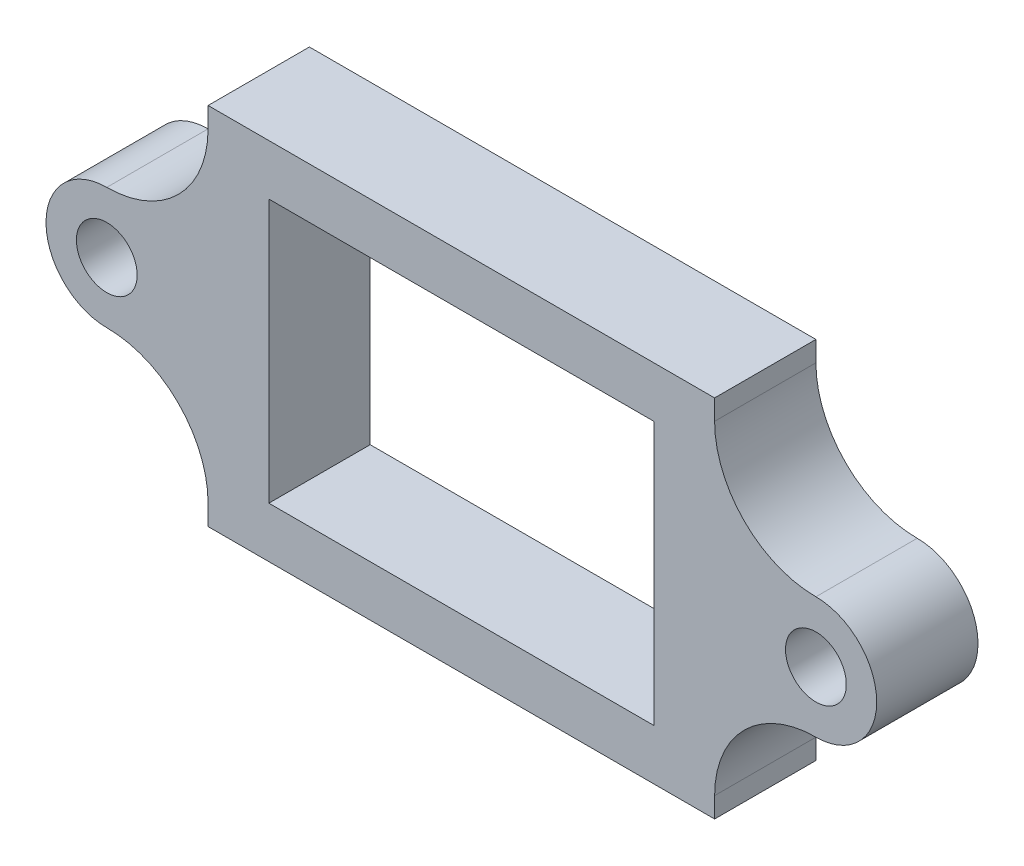
ISO-10303-21;
HEADER;
FILE_DESCRIPTION(('STEP AP214'),'2;1');
FILE_NAME('part.step','',(''),(''),'','','');
FILE_SCHEMA(('AUTOMOTIVE_DESIGN { 1 0 10303 214 1 1 1 1 }'));
ENDSEC;
DATA;
#1=APPLICATION_CONTEXT('core data for automotive mechanical design processes');
#2=APPLICATION_PROTOCOL_DEFINITION('international standard','automotive_design',2000,#1);
#3=PRODUCT_CONTEXT('',#1,'mechanical');
#4=PRODUCT('Part','Part','',(#3));
#5=PRODUCT_RELATED_PRODUCT_CATEGORY('part','',(#4));
#6=PRODUCT_DEFINITION_FORMATION('','',#4);
#7=PRODUCT_DEFINITION_CONTEXT('part definition',#1,'design');
#8=PRODUCT_DEFINITION('design','',#6,#7);
#9=PRODUCT_DEFINITION_SHAPE('','',#8);
#10=(LENGTH_UNIT() NAMED_UNIT(*) SI_UNIT(.MILLI.,.METRE.));
#11=(NAMED_UNIT(*) PLANE_ANGLE_UNIT() SI_UNIT($,.RADIAN.));
#12=(NAMED_UNIT(*) SI_UNIT($,.STERADIAN.) SOLID_ANGLE_UNIT());
#13=UNCERTAINTY_MEASURE_WITH_UNIT(LENGTH_MEASURE(1.E-05),#10,'distance_accuracy_value','');
#14=(GEOMETRIC_REPRESENTATION_CONTEXT(3) GLOBAL_UNCERTAINTY_ASSIGNED_CONTEXT((#13)) GLOBAL_UNIT_ASSIGNED_CONTEXT((#10,
#11,#12)) REPRESENTATION_CONTEXT('',''));
#15=CARTESIAN_POINT('',(0.,0.,0.));
#16=DIRECTION('',(0.,0.,1.));
#17=DIRECTION('',(1.,0.,0.));
#18=AXIS2_PLACEMENT_3D('',#15,#16,#17);
#19=CARTESIAN_POINT('',(-12.5,-9.,5.));
#20=DIRECTION('',(1.,0.,0.));
#21=DIRECTION('',(0.,0.,-1.));
#22=AXIS2_PLACEMENT_3D('',#19,#20,#21);
#23=PLANE('',#22);
#24=DIRECTION('',(0.,-1.,0.));
#25=VECTOR('',#24,1.);
#26=CARTESIAN_POINT('',(-12.5,-9.,0.));
#27=LINE('',#26,#25);
#28=CARTESIAN_POINT('',(-12.5,9.,0.));
#29=VERTEX_POINT('',#28);
#30=CARTESIAN_POINT('',(-12.5,8.,0.));
#31=VERTEX_POINT('',#30);
#32=EDGE_CURVE('E249',#29,#31,#27,.T.);
#33=ORIENTED_EDGE('',*,*,#32,.T.);
#34=DIRECTION('',(0.,0.,-1.));
#35=VECTOR('',#34,1.);
#36=CARTESIAN_POINT('',(-12.5,8.,5.));
#37=LINE('',#36,#35);
#38=CARTESIAN_POINT('',(-12.5,8.,5.));
#39=VERTEX_POINT('',#38);
#40=EDGE_CURVE('E267',#31,#39,#37,.F.);
#41=ORIENTED_EDGE('',*,*,#40,.T.);
#42=DIRECTION('',(0.,-1.,0.));
#43=VECTOR('',#42,1.);
#44=CARTESIAN_POINT('',(-12.5,-9.,5.));
#45=LINE('',#44,#43);
#46=CARTESIAN_POINT('',(-12.5,9.,5.));
#47=VERTEX_POINT('',#46);
#48=EDGE_CURVE('E239',#47,#39,#45,.T.);
#49=ORIENTED_EDGE('',*,*,#48,.F.);
#50=DIRECTION('',(0.,0.,-1.));
#51=VECTOR('',#50,1.);
#52=CARTESIAN_POINT('',(-12.5,9.,5.));
#53=LINE('',#52,#51);
#54=EDGE_CURVE('E259',#47,#29,#53,.T.);
#55=ORIENTED_EDGE('',*,*,#54,.T.);
#56=EDGE_LOOP('',(#33,#41,#49,#55));
#57=FACE_BOUND('',#56,.T.);
#58=ADVANCED_FACE('F37',(#57),#23,.F.);
#59=CARTESIAN_POINT('',(12.5,-9.,5.));
#60=DIRECTION('',(-1.,0.,0.));
#61=DIRECTION('',(0.,0.,1.));
#62=AXIS2_PLACEMENT_3D('',#59,#60,#61);
#63=PLANE('',#62);
#64=DIRECTION('',(0.,1.,0.));
#65=VECTOR('',#64,1.);
#66=CARTESIAN_POINT('',(12.5,-9.,0.));
#67=LINE('',#66,#65);
#68=CARTESIAN_POINT('',(12.5,-9.,0.));
#69=VERTEX_POINT('',#68);
#70=CARTESIAN_POINT('',(12.5,-8.,0.));
#71=VERTEX_POINT('',#70);
#72=EDGE_CURVE('E245',#69,#71,#67,.T.);
#73=ORIENTED_EDGE('',*,*,#72,.T.);
#74=DIRECTION('',(0.,0.,-1.));
#75=VECTOR('',#74,1.);
#76=CARTESIAN_POINT('',(12.5,-8.,5.));
#77=LINE('',#76,#75);
#78=CARTESIAN_POINT('',(12.5,-8.,5.));
#79=VERTEX_POINT('',#78);
#80=EDGE_CURVE('E58',#71,#79,#77,.F.);
#81=ORIENTED_EDGE('',*,*,#80,.T.);
#82=DIRECTION('',(0.,1.,0.));
#83=VECTOR('',#82,1.);
#84=CARTESIAN_POINT('',(12.5,-9.,5.));
#85=LINE('',#84,#83);
#86=CARTESIAN_POINT('',(12.5,-9.,5.));
#87=VERTEX_POINT('',#86);
#88=EDGE_CURVE('E233',#87,#79,#85,.T.);
#89=ORIENTED_EDGE('',*,*,#88,.F.);
#90=DIRECTION('',(0.,0.,-1.));
#91=VECTOR('',#90,1.);
#92=CARTESIAN_POINT('',(12.5,-9.,5.));
#93=LINE('',#92,#91);
#94=EDGE_CURVE('E244',#87,#69,#93,.T.);
#95=ORIENTED_EDGE('',*,*,#94,.T.);
#96=EDGE_LOOP('',(#73,#81,#89,#95));
#97=FACE_BOUND('',#96,.T.);
#98=ADVANCED_FACE('F304',(#97),#63,.F.);
#99=CARTESIAN_POINT('',(0.,0.,5.));
#100=DIRECTION('',(0.,0.,-1.));
#101=DIRECTION('',(-1.,0.,0.));
#102=AXIS2_PLACEMENT_3D('',#99,#100,#101);
#103=PLANE('',#102);
#104=ORIENTED_EDGE('',*,*,#88,.T.);
#105=CARTESIAN_POINT('',(17.5,-8.,5.));
#106=DIRECTION('',(0.,0.,-1.));
#107=DIRECTION('',(-1.,0.,0.));
#108=AXIS2_PLACEMENT_3D('',#105,#106,#107);
#109=CIRCLE('',#108,5.);
#110=CARTESIAN_POINT('',(17.5,-3.,5.));
#111=VERTEX_POINT('',#110);
#112=EDGE_CURVE('E11',#79,#111,#109,.T.);
#113=ORIENTED_EDGE('',*,*,#112,.T.);
#114=CARTESIAN_POINT('',(17.5,0.,5.));
#115=DIRECTION('',(0.,0.,-1.));
#116=DIRECTION('',(-1.,0.,0.));
#117=AXIS2_PLACEMENT_3D('',#114,#115,#116);
#118=CIRCLE('',#117,3.);
#119=CARTESIAN_POINT('',(17.5,3.,5.));
#120=VERTEX_POINT('',#119);
#121=EDGE_CURVE('E191',#120,#111,#118,.T.);
#122=ORIENTED_EDGE('',*,*,#121,.F.);
#123=CARTESIAN_POINT('',(17.5,8.,5.));
#124=DIRECTION('',(0.,0.,-1.));
#125=DIRECTION('',(-1.,0.,0.));
#126=AXIS2_PLACEMENT_3D('',#123,#124,#125);
#127=CIRCLE('',#126,5.);
#128=CARTESIAN_POINT('',(12.5,8.,5.));
#129=VERTEX_POINT('',#128);
#130=EDGE_CURVE('E280',#120,#129,#127,.T.);
#131=ORIENTED_EDGE('',*,*,#130,.T.);
#132=CARTESIAN_POINT('',(12.5,9.,5.));
#133=VERTEX_POINT('',#132);
#134=EDGE_CURVE('E236',#129,#133,#85,.T.);
#135=ORIENTED_EDGE('',*,*,#134,.T.);
#136=DIRECTION('',(-1.,0.,0.));
#137=VECTOR('',#136,1.);
#138=CARTESIAN_POINT('',(-12.5,9.,5.));
#139=LINE('',#138,#137);
#140=EDGE_CURVE('E235',#133,#47,#139,.T.);
#141=ORIENTED_EDGE('',*,*,#140,.T.);
#142=ORIENTED_EDGE('',*,*,#48,.T.);
#143=CARTESIAN_POINT('',(-17.5,8.,5.));
#144=DIRECTION('',(0.,0.,-1.));
#145=DIRECTION('',(-1.,0.,0.));
#146=AXIS2_PLACEMENT_3D('',#143,#144,#145);
#147=CIRCLE('',#146,5.);
#148=CARTESIAN_POINT('',(-17.5,3.,5.));
#149=VERTEX_POINT('',#148);
#150=EDGE_CURVE('E276',#39,#149,#147,.T.);
#151=ORIENTED_EDGE('',*,*,#150,.T.);
#152=CARTESIAN_POINT('',(-17.5,0.,5.));
#153=DIRECTION('',(0.,0.,-1.));
#154=DIRECTION('',(1.,0.,0.));
#155=AXIS2_PLACEMENT_3D('',#152,#153,#154);
#156=CIRCLE('',#155,3.);
#157=CARTESIAN_POINT('',(-17.5,-3.,5.));
#158=VERTEX_POINT('',#157);
#159=EDGE_CURVE('E171',#158,#149,#156,.T.);
#160=ORIENTED_EDGE('',*,*,#159,.F.);
#161=CARTESIAN_POINT('',(-17.5,-8.,5.));
#162=DIRECTION('',(0.,0.,-1.));
#163=DIRECTION('',(-1.,0.,0.));
#164=AXIS2_PLACEMENT_3D('',#161,#162,#163);
#165=CIRCLE('',#164,5.);
#166=CARTESIAN_POINT('',(-12.5,-8.,5.));
#167=VERTEX_POINT('',#166);
#168=EDGE_CURVE('E160',#158,#167,#165,.T.);
#169=ORIENTED_EDGE('',*,*,#168,.T.);
#170=CARTESIAN_POINT('',(-12.5,-9.,5.));
#171=VERTEX_POINT('',#170);
#172=EDGE_CURVE('E238',#167,#171,#45,.T.);
#173=ORIENTED_EDGE('',*,*,#172,.T.);
#174=DIRECTION('',(1.,0.,0.));
#175=VECTOR('',#174,1.);
#176=CARTESIAN_POINT('',(-12.5,-9.,5.));
#177=LINE('',#176,#175);
#178=EDGE_CURVE('E242',#171,#87,#177,.T.);
#179=ORIENTED_EDGE('',*,*,#178,.T.);
#180=EDGE_LOOP('',(#104,#113,#122,#131,#135,#141,#142,#151,#160,#169,#173,#179));
#181=FACE_BOUND('',#180,.T.);
#182=DIRECTION('',(0.,1.,0.));
#183=VECTOR('',#182,1.);
#184=CARTESIAN_POINT('',(9.5,-6.5,5.));
#185=LINE('',#184,#183);
#186=CARTESIAN_POINT('',(9.5,-6.5,5.));
#187=VERTEX_POINT('',#186);
#188=CARTESIAN_POINT('',(9.5,6.5,5.));
#189=VERTEX_POINT('',#188);
#190=EDGE_CURVE('E202',#187,#189,#185,.T.);
#191=ORIENTED_EDGE('',*,*,#190,.F.);
#192=DIRECTION('',(1.,0.,0.));
#193=VECTOR('',#192,1.);
#194=CARTESIAN_POINT('',(-9.5,-6.5,5.));
#195=LINE('',#194,#193);
#196=CARTESIAN_POINT('',(-9.5,-6.5,5.));
#197=VERTEX_POINT('',#196);
#198=EDGE_CURVE('E210',#197,#187,#195,.T.);
#199=ORIENTED_EDGE('',*,*,#198,.F.);
#200=DIRECTION('',(0.,-1.,0.));
#201=VECTOR('',#200,1.);
#202=CARTESIAN_POINT('',(-9.5,-6.5,5.));
#203=LINE('',#202,#201);
#204=CARTESIAN_POINT('',(-9.5,6.5,5.));
#205=VERTEX_POINT('',#204);
#206=EDGE_CURVE('E207',#205,#197,#203,.T.);
#207=ORIENTED_EDGE('',*,*,#206,.F.);
#208=DIRECTION('',(-1.,0.,0.));
#209=VECTOR('',#208,1.);
#210=CARTESIAN_POINT('',(-9.5,6.5,5.));
#211=LINE('',#210,#209);
#212=EDGE_CURVE('E204',#189,#205,#211,.T.);
#213=ORIENTED_EDGE('',*,*,#212,.F.);
#214=EDGE_LOOP('',(#191,#199,#207,#213));
#215=FACE_BOUND('',#214,.T.);
#216=CARTESIAN_POINT('',(17.5,0.,5.));
#217=DIRECTION('',(0.,0.,-1.));
#218=DIRECTION('',(-1.,0.,0.));
#219=AXIS2_PLACEMENT_3D('',#216,#217,#218);
#220=CIRCLE('',#219,1.5);
#221=CARTESIAN_POINT('',(16.,0.,5.));
#222=VERTEX_POINT('',#221);
#223=EDGE_CURVE('E185',#222,#222,#220,.T.);
#224=ORIENTED_EDGE('',*,*,#223,.T.);
#225=EDGE_LOOP('',(#224));
#226=FACE_BOUND('',#225,.T.);
#227=CARTESIAN_POINT('',(-17.5,0.,5.));
#228=DIRECTION('',(0.,0.,-1.));
#229=DIRECTION('',(1.,0.,0.));
#230=AXIS2_PLACEMENT_3D('',#227,#228,#229);
#231=CIRCLE('',#230,1.5);
#232=CARTESIAN_POINT('',(-16.,0.,5.));
#233=VERTEX_POINT('',#232);
#234=EDGE_CURVE('E170',#233,#233,#231,.T.);
#235=ORIENTED_EDGE('',*,*,#234,.T.);
#236=EDGE_LOOP('',(#235));
#237=FACE_BOUND('',#236,.T.);
#238=ADVANCED_FACE('F285',(#181,#215,#226,#237),#103,.F.);
#239=CARTESIAN_POINT('',(0.,0.,0.));
#240=DIRECTION('',(0.,0.,-1.));
#241=DIRECTION('',(-1.,0.,0.));
#242=AXIS2_PLACEMENT_3D('',#239,#240,#241);
#243=PLANE('',#242);
#244=ORIENTED_EDGE('',*,*,#72,.F.);
#245=DIRECTION('',(1.,0.,0.));
#246=VECTOR('',#245,1.);
#247=CARTESIAN_POINT('',(-12.5,-9.,0.));
#248=LINE('',#247,#246);
#249=CARTESIAN_POINT('',(-12.5,-9.,0.));
#250=VERTEX_POINT('',#249);
#251=EDGE_CURVE('E252',#250,#69,#248,.T.);
#252=ORIENTED_EDGE('',*,*,#251,.F.);
#253=CARTESIAN_POINT('',(-12.5,-8.,0.));
#254=VERTEX_POINT('',#253);
#255=EDGE_CURVE('E155',#254,#250,#27,.T.);
#256=ORIENTED_EDGE('',*,*,#255,.F.);
#257=CARTESIAN_POINT('',(-17.5,-8.,0.));
#258=DIRECTION('',(0.,0.,-1.));
#259=DIRECTION('',(-1.,0.,0.));
#260=AXIS2_PLACEMENT_3D('',#257,#258,#259);
#261=CIRCLE('',#260,5.);
#262=CARTESIAN_POINT('',(-17.5,-3.,0.));
#263=VERTEX_POINT('',#262);
#264=EDGE_CURVE('E149',#254,#263,#261,.F.);
#265=ORIENTED_EDGE('',*,*,#264,.T.);
#266=CARTESIAN_POINT('',(-17.5,0.,0.));
#267=DIRECTION('',(0.,0.,-1.));
#268=DIRECTION('',(1.,0.,0.));
#269=AXIS2_PLACEMENT_3D('',#266,#267,#268);
#270=CIRCLE('',#269,3.);
#271=CARTESIAN_POINT('',(-17.5,3.,0.));
#272=VERTEX_POINT('',#271);
#273=EDGE_CURVE('E153',#263,#272,#270,.T.);
#274=ORIENTED_EDGE('',*,*,#273,.T.);
#275=CARTESIAN_POINT('',(-17.5,8.,0.));
#276=DIRECTION('',(0.,0.,-1.));
#277=DIRECTION('',(-1.,0.,0.));
#278=AXIS2_PLACEMENT_3D('',#275,#276,#277);
#279=CIRCLE('',#278,5.);
#280=EDGE_CURVE('E274',#272,#31,#279,.F.);
#281=ORIENTED_EDGE('',*,*,#280,.T.);
#282=ORIENTED_EDGE('',*,*,#32,.F.);
#283=DIRECTION('',(-1.,0.,0.));
#284=VECTOR('',#283,1.);
#285=CARTESIAN_POINT('',(-12.5,9.,0.));
#286=LINE('',#285,#284);
#287=CARTESIAN_POINT('',(12.5,9.,0.));
#288=VERTEX_POINT('',#287);
#289=EDGE_CURVE('E247',#288,#29,#286,.T.);
#290=ORIENTED_EDGE('',*,*,#289,.F.);
#291=CARTESIAN_POINT('',(12.5,8.,0.));
#292=VERTEX_POINT('',#291);
#293=EDGE_CURVE('E232',#292,#288,#67,.T.);
#294=ORIENTED_EDGE('',*,*,#293,.F.);
#295=CARTESIAN_POINT('',(17.5,8.,0.));
#296=DIRECTION('',(0.,0.,-1.));
#297=DIRECTION('',(-1.,0.,0.));
#298=AXIS2_PLACEMENT_3D('',#295,#296,#297);
#299=CIRCLE('',#298,5.);
#300=CARTESIAN_POINT('',(17.5,3.,0.));
#301=VERTEX_POINT('',#300);
#302=EDGE_CURVE('E278',#292,#301,#299,.F.);
#303=ORIENTED_EDGE('',*,*,#302,.T.);
#304=CARTESIAN_POINT('',(17.5,0.,0.));
#305=DIRECTION('',(0.,0.,-1.));
#306=DIRECTION('',(-1.,0.,0.));
#307=AXIS2_PLACEMENT_3D('',#304,#305,#306);
#308=CIRCLE('',#307,3.);
#309=CARTESIAN_POINT('',(17.5,-3.,0.));
#310=VERTEX_POINT('',#309);
#311=EDGE_CURVE('E188',#301,#310,#308,.T.);
#312=ORIENTED_EDGE('',*,*,#311,.T.);
#313=CARTESIAN_POINT('',(17.5,-8.,0.));
#314=DIRECTION('',(0.,0.,-1.));
#315=DIRECTION('',(-1.,0.,0.));
#316=AXIS2_PLACEMENT_3D('',#313,#314,#315);
#317=CIRCLE('',#316,5.);
#318=EDGE_CURVE('E45',#310,#71,#317,.F.);
#319=ORIENTED_EDGE('',*,*,#318,.T.);
#320=EDGE_LOOP('',(#244,#252,#256,#265,#274,#281,#282,#290,#294,#303,#312,#319));
#321=FACE_BOUND('',#320,.T.);
#322=DIRECTION('',(1.,0.,0.));
#323=VECTOR('',#322,1.);
#324=CARTESIAN_POINT('',(-9.5,-6.5,0.));
#325=LINE('',#324,#323);
#326=CARTESIAN_POINT('',(-9.5,-6.5,0.));
#327=VERTEX_POINT('',#326);
#328=CARTESIAN_POINT('',(9.5,-6.5,0.));
#329=VERTEX_POINT('',#328);
#330=EDGE_CURVE('E205',#327,#329,#325,.T.);
#331=ORIENTED_EDGE('',*,*,#330,.T.);
#332=DIRECTION('',(0.,1.,0.));
#333=VECTOR('',#332,1.);
#334=CARTESIAN_POINT('',(9.5,-6.5,0.));
#335=LINE('',#334,#333);
#336=CARTESIAN_POINT('',(9.5,6.5,0.));
#337=VERTEX_POINT('',#336);
#338=EDGE_CURVE('E199',#329,#337,#335,.T.);
#339=ORIENTED_EDGE('',*,*,#338,.T.);
#340=DIRECTION('',(-1.,0.,0.));
#341=VECTOR('',#340,1.);
#342=CARTESIAN_POINT('',(-9.5,6.5,0.));
#343=LINE('',#342,#341);
#344=CARTESIAN_POINT('',(-9.5,6.5,0.));
#345=VERTEX_POINT('',#344);
#346=EDGE_CURVE('E215',#337,#345,#343,.T.);
#347=ORIENTED_EDGE('',*,*,#346,.T.);
#348=DIRECTION('',(0.,-1.,0.));
#349=VECTOR('',#348,1.);
#350=CARTESIAN_POINT('',(-9.5,-6.5,0.));
#351=LINE('',#350,#349);
#352=EDGE_CURVE('E218',#345,#327,#351,.T.);
#353=ORIENTED_EDGE('',*,*,#352,.T.);
#354=EDGE_LOOP('',(#331,#339,#347,#353));
#355=FACE_BOUND('',#354,.T.);
#356=CARTESIAN_POINT('',(17.5,0.,0.));
#357=DIRECTION('',(0.,0.,-1.));
#358=DIRECTION('',(-1.,0.,0.));
#359=AXIS2_PLACEMENT_3D('',#356,#357,#358);
#360=CIRCLE('',#359,1.5);
#361=CARTESIAN_POINT('',(16.,0.,0.));
#362=VERTEX_POINT('',#361);
#363=EDGE_CURVE('E182',#362,#362,#360,.T.);
#364=ORIENTED_EDGE('',*,*,#363,.F.);
#365=EDGE_LOOP('',(#364));
#366=FACE_BOUND('',#365,.T.);
#367=CARTESIAN_POINT('',(-17.5,0.,0.));
#368=DIRECTION('',(0.,0.,-1.));
#369=DIRECTION('',(1.,0.,0.));
#370=AXIS2_PLACEMENT_3D('',#367,#368,#369);
#371=CIRCLE('',#370,1.5);
#372=CARTESIAN_POINT('',(-16.,0.,0.));
#373=VERTEX_POINT('',#372);
#374=EDGE_CURVE('E179',#373,#373,#371,.T.);
#375=ORIENTED_EDGE('',*,*,#374,.F.);
#376=EDGE_LOOP('',(#375));
#377=FACE_BOUND('',#376,.T.);
#378=ADVANCED_FACE('F151',(#321,#355,#366,#377),#243,.T.);
#379=ORIENTED_EDGE('',*,*,#134,.F.);
#380=DIRECTION('',(0.,0.,-1.));
#381=VECTOR('',#380,1.);
#382=CARTESIAN_POINT('',(12.5,8.,5.));
#383=LINE('',#382,#381);
#384=EDGE_CURVE('E269',#129,#292,#383,.T.);
#385=ORIENTED_EDGE('',*,*,#384,.T.);
#386=ORIENTED_EDGE('',*,*,#293,.T.);
#387=DIRECTION('',(0.,0.,-1.));
#388=VECTOR('',#387,1.);
#389=CARTESIAN_POINT('',(12.5,9.,5.));
#390=LINE('',#389,#388);
#391=EDGE_CURVE('E262',#133,#288,#390,.T.);
#392=ORIENTED_EDGE('',*,*,#391,.F.);
#393=EDGE_LOOP('',(#379,#385,#386,#392));
#394=FACE_BOUND('',#393,.T.);
#395=ADVANCED_FACE('F292',(#394),#63,.F.);
#396=CARTESIAN_POINT('',(-12.5,9.,5.));
#397=DIRECTION('',(0.,-1.,0.));
#398=DIRECTION('',(0.,0.,-1.));
#399=AXIS2_PLACEMENT_3D('',#396,#397,#398);
#400=PLANE('',#399);
#401=ORIENTED_EDGE('',*,*,#289,.T.);
#402=ORIENTED_EDGE('',*,*,#54,.F.);
#403=ORIENTED_EDGE('',*,*,#140,.F.);
#404=ORIENTED_EDGE('',*,*,#391,.T.);
#405=EDGE_LOOP('',(#401,#402,#403,#404));
#406=FACE_BOUND('',#405,.T.);
#407=ADVANCED_FACE('F320',(#406),#400,.F.);
#408=ORIENTED_EDGE('',*,*,#172,.F.);
#409=DIRECTION('',(0.,0.,-1.));
#410=VECTOR('',#409,1.);
#411=CARTESIAN_POINT('',(-12.5,-8.,5.));
#412=LINE('',#411,#410);
#413=EDGE_CURVE('E265',#167,#254,#412,.T.);
#414=ORIENTED_EDGE('',*,*,#413,.T.);
#415=ORIENTED_EDGE('',*,*,#255,.T.);
#416=DIRECTION('',(0.,0.,-1.));
#417=VECTOR('',#416,1.);
#418=CARTESIAN_POINT('',(-12.5,-9.,5.));
#419=LINE('',#418,#417);
#420=EDGE_CURVE('E256',#171,#250,#419,.T.);
#421=ORIENTED_EDGE('',*,*,#420,.F.);
#422=EDGE_LOOP('',(#408,#414,#415,#421));
#423=FACE_BOUND('',#422,.T.);
#424=ADVANCED_FACE('F310',(#423),#23,.F.);
#425=CARTESIAN_POINT('',(-12.5,-9.,5.));
#426=DIRECTION('',(0.,1.,0.));
#427=DIRECTION('',(0.,0.,1.));
#428=AXIS2_PLACEMENT_3D('',#425,#426,#427);
#429=PLANE('',#428);
#430=ORIENTED_EDGE('',*,*,#251,.T.);
#431=ORIENTED_EDGE('',*,*,#94,.F.);
#432=ORIENTED_EDGE('',*,*,#178,.F.);
#433=ORIENTED_EDGE('',*,*,#420,.T.);
#434=EDGE_LOOP('',(#430,#431,#432,#433));
#435=FACE_BOUND('',#434,.T.);
#436=ADVANCED_FACE('F306',(#435),#429,.F.);
#437=CARTESIAN_POINT('',(9.5,-6.5,5.));
#438=DIRECTION('',(-1.,0.,0.));
#439=DIRECTION('',(0.,0.,1.));
#440=AXIS2_PLACEMENT_3D('',#437,#438,#439);
#441=PLANE('',#440);
#442=ORIENTED_EDGE('',*,*,#338,.F.);
#443=DIRECTION('',(0.,0.,-1.));
#444=VECTOR('',#443,1.);
#445=CARTESIAN_POINT('',(9.5,-6.5,5.));
#446=LINE('',#445,#444);
#447=EDGE_CURVE('E212',#187,#329,#446,.T.);
#448=ORIENTED_EDGE('',*,*,#447,.F.);
#449=ORIENTED_EDGE('',*,*,#190,.T.);
#450=DIRECTION('',(0.,0.,-1.));
#451=VECTOR('',#450,1.);
#452=CARTESIAN_POINT('',(9.5,6.5,5.));
#453=LINE('',#452,#451);
#454=EDGE_CURVE('E229',#189,#337,#453,.T.);
#455=ORIENTED_EDGE('',*,*,#454,.T.);
#456=EDGE_LOOP('',(#442,#448,#449,#455));
#457=FACE_BOUND('',#456,.T.);
#458=ADVANCED_FACE('F336',(#457),#441,.T.);
#459=CARTESIAN_POINT('',(-9.5,6.5,5.));
#460=DIRECTION('',(0.,-1.,0.));
#461=DIRECTION('',(0.,0.,-1.));
#462=AXIS2_PLACEMENT_3D('',#459,#460,#461);
#463=PLANE('',#462);
#464=ORIENTED_EDGE('',*,*,#346,.F.);
#465=ORIENTED_EDGE('',*,*,#454,.F.);
#466=ORIENTED_EDGE('',*,*,#212,.T.);
#467=DIRECTION('',(0.,0.,-1.));
#468=VECTOR('',#467,1.);
#469=CARTESIAN_POINT('',(-9.5,6.5,5.));
#470=LINE('',#469,#468);
#471=EDGE_CURVE('E227',#205,#345,#470,.T.);
#472=ORIENTED_EDGE('',*,*,#471,.T.);
#473=EDGE_LOOP('',(#464,#465,#466,#472));
#474=FACE_BOUND('',#473,.T.);
#475=ADVANCED_FACE('F343',(#474),#463,.T.);
#476=CARTESIAN_POINT('',(-9.5,-6.5,5.));
#477=DIRECTION('',(1.,0.,0.));
#478=DIRECTION('',(0.,0.,-1.));
#479=AXIS2_PLACEMENT_3D('',#476,#477,#478);
#480=PLANE('',#479);
#481=ORIENTED_EDGE('',*,*,#352,.F.);
#482=ORIENTED_EDGE('',*,*,#471,.F.);
#483=ORIENTED_EDGE('',*,*,#206,.T.);
#484=DIRECTION('',(0.,0.,-1.));
#485=VECTOR('',#484,1.);
#486=CARTESIAN_POINT('',(-9.5,-6.5,5.));
#487=LINE('',#486,#485);
#488=EDGE_CURVE('E225',#197,#327,#487,.T.);
#489=ORIENTED_EDGE('',*,*,#488,.T.);
#490=EDGE_LOOP('',(#481,#482,#483,#489));
#491=FACE_BOUND('',#490,.T.);
#492=ADVANCED_FACE('F347',(#491),#480,.T.);
#493=CARTESIAN_POINT('',(-9.5,-6.5,5.));
#494=DIRECTION('',(0.,1.,0.));
#495=DIRECTION('',(0.,0.,1.));
#496=AXIS2_PLACEMENT_3D('',#493,#494,#495);
#497=PLANE('',#496);
#498=ORIENTED_EDGE('',*,*,#330,.F.);
#499=ORIENTED_EDGE('',*,*,#488,.F.);
#500=ORIENTED_EDGE('',*,*,#198,.T.);
#501=ORIENTED_EDGE('',*,*,#447,.T.);
#502=EDGE_LOOP('',(#498,#499,#500,#501));
#503=FACE_BOUND('',#502,.T.);
#504=ADVANCED_FACE('F351',(#503),#497,.T.);
#505=CARTESIAN_POINT('',(17.5,0.,5.));
#506=DIRECTION('',(0.,0.,-1.));
#507=DIRECTION('',(-1.,0.,0.));
#508=AXIS2_PLACEMENT_3D('',#505,#506,#507);
#509=CYLINDRICAL_SURFACE('',#508,3.);
#510=ORIENTED_EDGE('',*,*,#311,.F.);
#511=DIRECTION('',(0.,0.,-1.));
#512=VECTOR('',#511,1.);
#513=CARTESIAN_POINT('',(17.5,3.,5.));
#514=LINE('',#513,#512);
#515=EDGE_CURVE('E196',#120,#301,#514,.T.);
#516=ORIENTED_EDGE('',*,*,#515,.F.);
#517=ORIENTED_EDGE('',*,*,#121,.T.);
#518=DIRECTION('',(0.,0.,-1.));
#519=VECTOR('',#518,1.);
#520=CARTESIAN_POINT('',(17.5,-3.,5.));
#521=LINE('',#520,#519);
#522=EDGE_CURVE('E194',#111,#310,#521,.T.);
#523=ORIENTED_EDGE('',*,*,#522,.T.);
#524=EDGE_LOOP('',(#510,#516,#517,#523));
#525=FACE_BOUND('',#524,.T.);
#526=ADVANCED_FACE('F298',(#525),#509,.T.);
#527=CARTESIAN_POINT('',(17.5,0.,5.));
#528=DIRECTION('',(0.,0.,-1.));
#529=DIRECTION('',(-1.,0.,0.));
#530=AXIS2_PLACEMENT_3D('',#527,#528,#529);
#531=CYLINDRICAL_SURFACE('',#530,1.5);
#532=ORIENTED_EDGE('',*,*,#223,.F.);
#533=EDGE_LOOP('',(#532));
#534=FACE_BOUND('',#533,.T.);
#535=ORIENTED_EDGE('',*,*,#363,.T.);
#536=EDGE_LOOP('',(#535));
#537=FACE_BOUND('',#536,.T.);
#538=ADVANCED_FACE('F358',(#534,#537),#531,.F.);
#539=CARTESIAN_POINT('',(-17.5,0.,5.));
#540=DIRECTION('',(0.,0.,-1.));
#541=DIRECTION('',(-1.,0.,0.));
#542=AXIS2_PLACEMENT_3D('',#539,#540,#541);
#543=CYLINDRICAL_SURFACE('',#542,3.);
#544=ORIENTED_EDGE('',*,*,#273,.F.);
#545=DIRECTION('',(0.,0.,-1.));
#546=VECTOR('',#545,1.);
#547=CARTESIAN_POINT('',(-17.5,-3.,5.));
#548=LINE('',#547,#546);
#549=EDGE_CURVE('E166',#158,#263,#548,.T.);
#550=ORIENTED_EDGE('',*,*,#549,.F.);
#551=ORIENTED_EDGE('',*,*,#159,.T.);
#552=DIRECTION('',(0.,0.,-1.));
#553=VECTOR('',#552,1.);
#554=CARTESIAN_POINT('',(-17.5,3.,5.));
#555=LINE('',#554,#553);
#556=EDGE_CURVE('E169',#149,#272,#555,.T.);
#557=ORIENTED_EDGE('',*,*,#556,.T.);
#558=EDGE_LOOP('',(#544,#550,#551,#557));
#559=FACE_BOUND('',#558,.T.);
#560=ADVANCED_FACE('F164',(#559),#543,.T.);
#561=CARTESIAN_POINT('',(-17.5,0.,5.));
#562=DIRECTION('',(0.,0.,-1.));
#563=DIRECTION('',(-1.,0.,0.));
#564=AXIS2_PLACEMENT_3D('',#561,#562,#563);
#565=CYLINDRICAL_SURFACE('',#564,1.5);
#566=ORIENTED_EDGE('',*,*,#234,.F.);
#567=EDGE_LOOP('',(#566));
#568=FACE_BOUND('',#567,.T.);
#569=ORIENTED_EDGE('',*,*,#374,.T.);
#570=EDGE_LOOP('',(#569));
#571=FACE_BOUND('',#570,.T.);
#572=ADVANCED_FACE('F362',(#568,#571),#565,.F.);
#573=CARTESIAN_POINT('',(-17.5,-8.,5.));
#574=DIRECTION('',(0.,0.,-1.));
#575=DIRECTION('',(-1.,0.,0.));
#576=AXIS2_PLACEMENT_3D('',#573,#574,#575);
#577=CYLINDRICAL_SURFACE('',#576,5.);
#578=ORIENTED_EDGE('',*,*,#168,.F.);
#579=ORIENTED_EDGE('',*,*,#549,.T.);
#580=ORIENTED_EDGE('',*,*,#264,.F.);
#581=ORIENTED_EDGE('',*,*,#413,.F.);
#582=EDGE_LOOP('',(#578,#579,#580,#581));
#583=FACE_BOUND('',#582,.T.);
#584=ADVANCED_FACE('F174',(#583),#577,.F.);
#585=CARTESIAN_POINT('',(-17.5,8.,5.));
#586=DIRECTION('',(0.,0.,-1.));
#587=DIRECTION('',(-1.,0.,0.));
#588=AXIS2_PLACEMENT_3D('',#585,#586,#587);
#589=CYLINDRICAL_SURFACE('',#588,5.);
#590=ORIENTED_EDGE('',*,*,#150,.F.);
#591=ORIENTED_EDGE('',*,*,#40,.F.);
#592=ORIENTED_EDGE('',*,*,#280,.F.);
#593=ORIENTED_EDGE('',*,*,#556,.F.);
#594=EDGE_LOOP('',(#590,#591,#592,#593));
#595=FACE_BOUND('',#594,.T.);
#596=ADVANCED_FACE('F313',(#595),#589,.F.);
#597=CARTESIAN_POINT('',(17.5,8.,5.));
#598=DIRECTION('',(0.,0.,-1.));
#599=DIRECTION('',(-1.,0.,0.));
#600=AXIS2_PLACEMENT_3D('',#597,#598,#599);
#601=CYLINDRICAL_SURFACE('',#600,5.);
#602=ORIENTED_EDGE('',*,*,#130,.F.);
#603=ORIENTED_EDGE('',*,*,#515,.T.);
#604=ORIENTED_EDGE('',*,*,#302,.F.);
#605=ORIENTED_EDGE('',*,*,#384,.F.);
#606=EDGE_LOOP('',(#602,#603,#604,#605));
#607=FACE_BOUND('',#606,.T.);
#608=ADVANCED_FACE('F294',(#607),#601,.F.);
#609=CARTESIAN_POINT('',(17.5,-8.,5.));
#610=DIRECTION('',(0.,0.,-1.));
#611=DIRECTION('',(-1.,0.,0.));
#612=AXIS2_PLACEMENT_3D('',#609,#610,#611);
#613=CYLINDRICAL_SURFACE('',#612,5.);
#614=ORIENTED_EDGE('',*,*,#112,.F.);
#615=ORIENTED_EDGE('',*,*,#80,.F.);
#616=ORIENTED_EDGE('',*,*,#318,.F.);
#617=ORIENTED_EDGE('',*,*,#522,.F.);
#618=EDGE_LOOP('',(#614,#615,#616,#617));
#619=FACE_BOUND('',#618,.T.);
#620=ADVANCED_FACE('F39',(#619),#613,.F.);
#621=CLOSED_SHELL('',(#58,#98,#238,#378,#395,#407,#424,#436,#458,#475,#492,#504,#526,#538,#560,
#572,#584,#596,#608,#620));
#622=MANIFOLD_SOLID_BREP('B2',#621);
#623=ADVANCED_BREP_SHAPE_REPRESENTATION('',(#18,#622),#14);
#624=SHAPE_DEFINITION_REPRESENTATION(#9,#623);
ENDSEC;
END-ISO-10303-21;
